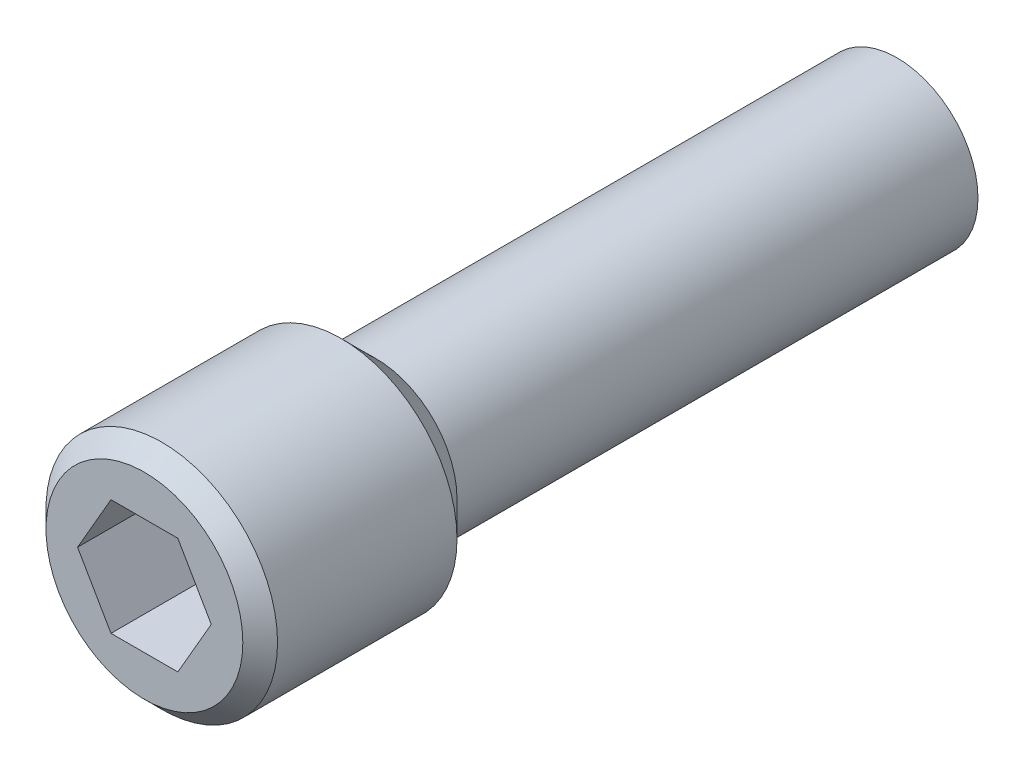
ISO-10303-21;
HEADER;
FILE_DESCRIPTION(('STEP AP214'),'2;1');
FILE_NAME('part.step','',(''),(''),'','','');
FILE_SCHEMA(('AUTOMOTIVE_DESIGN { 1 0 10303 214 1 1 1 1 }'));
ENDSEC;
DATA;
#1=APPLICATION_CONTEXT('core data for automotive mechanical design processes');
#2=APPLICATION_PROTOCOL_DEFINITION('international standard','automotive_design',2000,#1);
#3=PRODUCT_CONTEXT('',#1,'mechanical');
#4=PRODUCT('Part','Part','',(#3));
#5=PRODUCT_RELATED_PRODUCT_CATEGORY('part','',(#4));
#6=PRODUCT_DEFINITION_FORMATION('','',#4);
#7=PRODUCT_DEFINITION_CONTEXT('part definition',#1,'design');
#8=PRODUCT_DEFINITION('design','',#6,#7);
#9=PRODUCT_DEFINITION_SHAPE('','',#8);
#10=(LENGTH_UNIT() NAMED_UNIT(*) SI_UNIT(.MILLI.,.METRE.));
#11=(NAMED_UNIT(*) PLANE_ANGLE_UNIT() SI_UNIT($,.RADIAN.));
#12=(NAMED_UNIT(*) SI_UNIT($,.STERADIAN.) SOLID_ANGLE_UNIT());
#13=UNCERTAINTY_MEASURE_WITH_UNIT(LENGTH_MEASURE(1.E-05),#10,'distance_accuracy_value','');
#14=(GEOMETRIC_REPRESENTATION_CONTEXT(3) GLOBAL_UNCERTAINTY_ASSIGNED_CONTEXT((#13)) GLOBAL_UNIT_ASSIGNED_CONTEXT((#10,
#11,#12)) REPRESENTATION_CONTEXT('',''));
#15=CARTESIAN_POINT('',(0.,0.,0.));
#16=DIRECTION('',(0.,0.,1.));
#17=DIRECTION('',(1.,0.,0.));
#18=AXIS2_PLACEMENT_3D('',#15,#16,#17);
#19=CARTESIAN_POINT('',(0.,0.,59.2));
#20=DIRECTION('',(0.,0.,-1.));
#21=DIRECTION('',(-1.,0.,0.));
#22=AXIS2_PLACEMENT_3D('',#19,#20,#21);
#23=CYLINDRICAL_SURFACE('',#22,0.95);
#24=CARTESIAN_POINT('',(0.,0.,48.));
#25=DIRECTION('',(0.,0.,-1.));
#26=DIRECTION('',(1.,0.,0.));
#27=AXIS2_PLACEMENT_3D('',#24,#25,#26);
#28=CIRCLE('',#27,0.95);
#29=CARTESIAN_POINT('',(0.95,0.,48.));
#30=VERTEX_POINT('',#29);
#31=EDGE_CURVE('E26',#30,#30,#28,.T.);
#32=ORIENTED_EDGE('',*,*,#31,.T.);
#33=EDGE_LOOP('',(#32));
#34=FACE_BOUND('',#33,.T.);
#35=CARTESIAN_POINT('',(0.,0.,59.2));
#36=DIRECTION('',(0.,0.,-1.));
#37=DIRECTION('',(-1.,0.,0.));
#38=AXIS2_PLACEMENT_3D('',#35,#36,#37);
#39=CIRCLE('',#38,0.95);
#40=CARTESIAN_POINT('',(-0.95,0.,59.2));
#41=VERTEX_POINT('',#40);
#42=EDGE_CURVE('E11',#41,#41,#39,.T.);
#43=ORIENTED_EDGE('',*,*,#42,.F.);
#44=EDGE_LOOP('',(#43));
#45=FACE_BOUND('',#44,.T.);
#46=ADVANCED_FACE('F17',(#34,#45),#23,.F.);
#47=CARTESIAN_POINT('',(0.,0.,61.));
#48=DIRECTION('',(0.,0.,-1.));
#49=DIRECTION('',(-1.,0.,0.));
#50=AXIS2_PLACEMENT_3D('',#47,#48,#49);
#51=CONICAL_SURFACE('',#50,1.7,0.785398163397457);
#52=CARTESIAN_POINT('',(0.,0.,61.));
#53=DIRECTION('',(0.,0.,1.));
#54=DIRECTION('',(1.,0.,0.));
#55=AXIS2_PLACEMENT_3D('',#52,#53,#54);
#56=CIRCLE('',#55,1.7);
#57=CARTESIAN_POINT('',(1.7,0.,61.));
#58=VERTEX_POINT('',#57);
#59=EDGE_CURVE('E159',#58,#58,#56,.T.);
#60=ORIENTED_EDGE('',*,*,#59,.F.);
#61=EDGE_LOOP('',(#60));
#62=FACE_BOUND('',#61,.T.);
#63=CARTESIAN_POINT('',(0.,0.,60.7));
#64=DIRECTION('',(0.,0.,-1.));
#65=DIRECTION('',(1.,0.,0.));
#66=AXIS2_PLACEMENT_3D('',#63,#64,#65);
#67=CIRCLE('',#66,2.);
#68=CARTESIAN_POINT('',(2.,0.,60.7));
#69=VERTEX_POINT('',#68);
#70=EDGE_CURVE('E155',#69,#69,#67,.T.);
#71=ORIENTED_EDGE('',*,*,#70,.F.);
#72=EDGE_LOOP('',(#71));
#73=FACE_BOUND('',#72,.T.);
#74=ADVANCED_FACE('F335',(#62,#73),#51,.T.);
#75=CARTESIAN_POINT('',(0.,0.,57.6));
#76=DIRECTION('',(0.,0.,1.));
#77=DIRECTION('',(1.,0.,0.));
#78=AXIS2_PLACEMENT_3D('',#75,#76,#77);
#79=CONICAL_SURFACE('',#78,2.,0.785398163397448);
#80=CARTESIAN_POINT('',(0.,0.,57.6));
#81=DIRECTION('',(0.,0.,1.));
#82=DIRECTION('',(1.,0.,0.));
#83=AXIS2_PLACEMENT_3D('',#80,#81,#82);
#84=CIRCLE('',#83,2.);
#85=CARTESIAN_POINT('',(2.,0.,57.6));
#86=VERTEX_POINT('',#85);
#87=EDGE_CURVE('E158',#86,#86,#84,.T.);
#88=ORIENTED_EDGE('',*,*,#87,.F.);
#89=EDGE_LOOP('',(#88));
#90=FACE_BOUND('',#89,.T.);
#91=CARTESIAN_POINT('',(0.,0.,57.));
#92=DIRECTION('',(0.,0.,1.));
#93=DIRECTION('',(1.,0.,0.));
#94=AXIS2_PLACEMENT_3D('',#91,#92,#93);
#95=CIRCLE('',#94,1.4);
#96=CARTESIAN_POINT('',(1.4,0.,57.));
#97=VERTEX_POINT('',#96);
#98=EDGE_CURVE('E165',#97,#97,#95,.T.);
#99=ORIENTED_EDGE('',*,*,#98,.T.);
#100=EDGE_LOOP('',(#99));
#101=FACE_BOUND('',#100,.T.);
#102=ADVANCED_FACE('F19',(#90,#101),#79,.T.);
#103=CARTESIAN_POINT('',(0.,0.,59.2));
#104=DIRECTION('',(0.,0.,1.));
#105=DIRECTION('',(1.,0.,0.));
#106=AXIS2_PLACEMENT_3D('',#103,#104,#105);
#107=PLANE('',#106);
#108=DIRECTION('',(1.,0.,0.));
#109=VECTOR('',#108,1.);
#110=CARTESIAN_POINT('',(0.,-1.,59.2));
#111=LINE('',#110,#109);
#112=CARTESIAN_POINT('',(-0.577350269189626,-1.,59.2));
#113=VERTEX_POINT('',#112);
#114=CARTESIAN_POINT('',(0.577350269189626,-1.,59.2));
#115=VERTEX_POINT('',#114);
#116=EDGE_CURVE('E243',#113,#115,#111,.T.);
#117=ORIENTED_EDGE('',*,*,#116,.T.);
#118=DIRECTION('',(0.5,0.866025403784439,0.));
#119=VECTOR('',#118,1.);
#120=CARTESIAN_POINT('',(0.866025403784439,-0.5,59.2));
#121=LINE('',#120,#119);
#122=CARTESIAN_POINT('',(1.15470053837925,0.,59.2));
#123=VERTEX_POINT('',#122);
#124=EDGE_CURVE('E269',#115,#123,#121,.T.);
#125=ORIENTED_EDGE('',*,*,#124,.T.);
#126=DIRECTION('',(-0.5,0.866025403784439,0.));
#127=VECTOR('',#126,1.);
#128=CARTESIAN_POINT('',(0.86602540378444,0.5,59.2));
#129=LINE('',#128,#127);
#130=CARTESIAN_POINT('',(0.577350269189627,1.,59.2));
#131=VERTEX_POINT('',#130);
#132=EDGE_CURVE('E150',#123,#131,#129,.T.);
#133=ORIENTED_EDGE('',*,*,#132,.T.);
#134=DIRECTION('',(-1.,0.,0.));
#135=VECTOR('',#134,1.);
#136=CARTESIAN_POINT('',(0.,1.,59.2));
#137=LINE('',#136,#135);
#138=CARTESIAN_POINT('',(-0.577350269189626,1.,59.2));
#139=VERTEX_POINT('',#138);
#140=EDGE_CURVE('E118',#131,#139,#137,.T.);
#141=ORIENTED_EDGE('',*,*,#140,.T.);
#142=DIRECTION('',(-0.5,-0.866025403784439,0.));
#143=VECTOR('',#142,1.);
#144=CARTESIAN_POINT('',(-0.866025403784439,0.5,59.2));
#145=LINE('',#144,#143);
#146=CARTESIAN_POINT('',(-1.15470053837925,0.,59.2));
#147=VERTEX_POINT('',#146);
#148=EDGE_CURVE('E111',#139,#147,#145,.T.);
#149=ORIENTED_EDGE('',*,*,#148,.T.);
#150=DIRECTION('',(0.5,-0.866025403784439,0.));
#151=VECTOR('',#150,1.);
#152=CARTESIAN_POINT('',(-0.866025403784438,-0.5,59.2));
#153=LINE('',#152,#151);
#154=EDGE_CURVE('E115',#147,#113,#153,.T.);
#155=ORIENTED_EDGE('',*,*,#154,.T.);
#156=EDGE_LOOP('',(#117,#125,#133,#141,#149,#155));
#157=FACE_BOUND('',#156,.T.);
#158=ORIENTED_EDGE('',*,*,#42,.T.);
#159=EDGE_LOOP('',(#158));
#160=FACE_BOUND('',#159,.T.);
#161=ADVANCED_FACE('F113',(#157,#160),#107,.T.);
#162=CARTESIAN_POINT('',(0.,0.,48.));
#163=DIRECTION('',(0.,0.,1.));
#164=DIRECTION('',(1.,0.,0.));
#165=AXIS2_PLACEMENT_3D('',#162,#163,#164);
#166=PLANE('',#165);
#167=CARTESIAN_POINT('',(0.,0.,48.));
#168=DIRECTION('',(0.,0.,1.));
#169=DIRECTION('',(1.,0.,0.));
#170=AXIS2_PLACEMENT_3D('',#167,#168,#169);
#171=CIRCLE('',#170,1.4);
#172=CARTESIAN_POINT('',(1.4,0.,48.));
#173=VERTEX_POINT('',#172);
#174=EDGE_CURVE('E162',#173,#173,#171,.T.);
#175=ORIENTED_EDGE('',*,*,#174,.F.);
#176=EDGE_LOOP('',(#175));
#177=FACE_BOUND('',#176,.T.);
#178=ORIENTED_EDGE('',*,*,#31,.F.);
#179=EDGE_LOOP('',(#178));
#180=FACE_BOUND('',#179,.T.);
#181=ADVANCED_FACE('F353',(#177,#180),#166,.F.);
#182=CARTESIAN_POINT('',(0.,0.,48.));
#183=DIRECTION('',(0.,0.,1.));
#184=DIRECTION('',(1.,0.,0.));
#185=AXIS2_PLACEMENT_3D('',#182,#183,#184);
#186=CYLINDRICAL_SURFACE('',#185,1.4);
#187=ORIENTED_EDGE('',*,*,#98,.F.);
#188=EDGE_LOOP('',(#187));
#189=FACE_BOUND('',#188,.T.);
#190=ORIENTED_EDGE('',*,*,#174,.T.);
#191=EDGE_LOOP('',(#190));
#192=FACE_BOUND('',#191,.T.);
#193=ADVANCED_FACE('F348',(#189,#192),#186,.T.);
#194=CARTESIAN_POINT('',(0.,0.,61.));
#195=DIRECTION('',(0.,0.,1.));
#196=DIRECTION('',(1.,0.,0.));
#197=AXIS2_PLACEMENT_3D('',#194,#195,#196);
#198=PLANE('',#197);
#199=DIRECTION('',(0.5,0.866025403784439,0.));
#200=VECTOR('',#199,1.);
#201=CARTESIAN_POINT('',(0.866025403784439,-0.5,61.));
#202=LINE('',#201,#200);
#203=CARTESIAN_POINT('',(0.577350269189626,-1.,61.));
#204=VERTEX_POINT('',#203);
#205=CARTESIAN_POINT('',(1.15470053837925,0.,61.));
#206=VERTEX_POINT('',#205);
#207=EDGE_CURVE('E257',#204,#206,#202,.T.);
#208=ORIENTED_EDGE('',*,*,#207,.F.);
#209=DIRECTION('',(1.,0.,0.));
#210=VECTOR('',#209,1.);
#211=CARTESIAN_POINT('',(0.,-1.,61.));
#212=LINE('',#211,#210);
#213=CARTESIAN_POINT('',(-0.577350269189626,-1.,61.));
#214=VERTEX_POINT('',#213);
#215=EDGE_CURVE('E140',#214,#204,#212,.T.);
#216=ORIENTED_EDGE('',*,*,#215,.F.);
#217=DIRECTION('',(0.5,-0.866025403784439,0.));
#218=VECTOR('',#217,1.);
#219=CARTESIAN_POINT('',(-0.866025403784438,-0.5,61.));
#220=LINE('',#219,#218);
#221=CARTESIAN_POINT('',(-1.15470053837925,0.,61.));
#222=VERTEX_POINT('',#221);
#223=EDGE_CURVE('E124',#222,#214,#220,.T.);
#224=ORIENTED_EDGE('',*,*,#223,.F.);
#225=DIRECTION('',(-0.5,-0.866025403784439,0.));
#226=VECTOR('',#225,1.);
#227=CARTESIAN_POINT('',(-0.866025403784439,0.5,61.));
#228=LINE('',#227,#226);
#229=CARTESIAN_POINT('',(-0.577350269189626,1.,61.));
#230=VERTEX_POINT('',#229);
#231=EDGE_CURVE('E130',#230,#222,#228,.T.);
#232=ORIENTED_EDGE('',*,*,#231,.F.);
#233=DIRECTION('',(-1.,0.,0.));
#234=VECTOR('',#233,1.);
#235=CARTESIAN_POINT('',(0.,1.,61.));
#236=LINE('',#235,#234);
#237=CARTESIAN_POINT('',(0.577350269189627,1.,61.));
#238=VERTEX_POINT('',#237);
#239=EDGE_CURVE('E154',#238,#230,#236,.T.);
#240=ORIENTED_EDGE('',*,*,#239,.F.);
#241=DIRECTION('',(-0.5,0.866025403784439,0.));
#242=VECTOR('',#241,1.);
#243=CARTESIAN_POINT('',(0.86602540378444,0.5,61.));
#244=LINE('',#243,#242);
#245=EDGE_CURVE('E153',#206,#238,#244,.T.);
#246=ORIENTED_EDGE('',*,*,#245,.F.);
#247=EDGE_LOOP('',(#208,#216,#224,#232,#240,#246));
#248=FACE_BOUND('',#247,.T.);
#249=ORIENTED_EDGE('',*,*,#59,.T.);
#250=EDGE_LOOP('',(#249));
#251=FACE_BOUND('',#250,.T.);
#252=ADVANCED_FACE('F311',(#248,#251),#198,.T.);
#253=CARTESIAN_POINT('',(0.,0.,57.));
#254=DIRECTION('',(0.,0.,1.));
#255=DIRECTION('',(1.,0.,0.));
#256=AXIS2_PLACEMENT_3D('',#253,#254,#255);
#257=CYLINDRICAL_SURFACE('',#256,2.);
#258=ORIENTED_EDGE('',*,*,#87,.T.);
#259=EDGE_LOOP('',(#258));
#260=FACE_BOUND('',#259,.T.);
#261=ORIENTED_EDGE('',*,*,#70,.T.);
#262=EDGE_LOOP('',(#261));
#263=FACE_BOUND('',#262,.T.);
#264=ADVANCED_FACE('F324',(#260,#263),#257,.T.);
#265=CARTESIAN_POINT('',(0.86602540378444,0.5,57.));
#266=DIRECTION('',(0.866025403784439,0.5,0.));
#267=DIRECTION('',(0.,0.,-1.));
#268=AXIS2_PLACEMENT_3D('',#265,#266,#267);
#269=PLANE('',#268);
#270=ORIENTED_EDGE('',*,*,#132,.F.);
#271=DIRECTION('',(0.,0.,1.));
#272=VECTOR('',#271,1.);
#273=CARTESIAN_POINT('',(1.15470053837925,0.,57.));
#274=LINE('',#273,#272);
#275=EDGE_CURVE('E251',#123,#206,#274,.T.);
#276=ORIENTED_EDGE('',*,*,#275,.T.);
#277=ORIENTED_EDGE('',*,*,#245,.T.);
#278=DIRECTION('',(0.,0.,1.));
#279=VECTOR('',#278,1.);
#280=CARTESIAN_POINT('',(0.577350269189627,1.,57.));
#281=LINE('',#280,#279);
#282=EDGE_CURVE('E178',#131,#238,#281,.T.);
#283=ORIENTED_EDGE('',*,*,#282,.F.);
#284=EDGE_LOOP('',(#270,#276,#277,#283));
#285=FACE_BOUND('',#284,.T.);
#286=ADVANCED_FACE('F322',(#285),#269,.F.);
#287=CARTESIAN_POINT('',(0.,1.,57.));
#288=DIRECTION('',(0.,1.,0.));
#289=DIRECTION('',(1.,0.,0.));
#290=AXIS2_PLACEMENT_3D('',#287,#288,#289);
#291=PLANE('',#290);
#292=ORIENTED_EDGE('',*,*,#140,.F.);
#293=ORIENTED_EDGE('',*,*,#282,.T.);
#294=ORIENTED_EDGE('',*,*,#239,.T.);
#295=DIRECTION('',(0.,0.,1.));
#296=VECTOR('',#295,1.);
#297=CARTESIAN_POINT('',(-0.577350269189626,1.,57.));
#298=LINE('',#297,#296);
#299=EDGE_CURVE('E123',#139,#230,#298,.T.);
#300=ORIENTED_EDGE('',*,*,#299,.F.);
#301=EDGE_LOOP('',(#292,#293,#294,#300));
#302=FACE_BOUND('',#301,.T.);
#303=ADVANCED_FACE('F307',(#302),#291,.F.);
#304=CARTESIAN_POINT('',(-0.866025403784439,0.5,57.));
#305=DIRECTION('',(-0.866025403784439,0.5,0.));
#306=DIRECTION('',(0.,0.,1.));
#307=AXIS2_PLACEMENT_3D('',#304,#305,#306);
#308=PLANE('',#307);
#309=ORIENTED_EDGE('',*,*,#148,.F.);
#310=ORIENTED_EDGE('',*,*,#299,.T.);
#311=ORIENTED_EDGE('',*,*,#231,.T.);
#312=DIRECTION('',(0.,0.,1.));
#313=VECTOR('',#312,1.);
#314=CARTESIAN_POINT('',(-1.15470053837925,0.,57.));
#315=LINE('',#314,#313);
#316=EDGE_CURVE('E127',#147,#222,#315,.T.);
#317=ORIENTED_EDGE('',*,*,#316,.F.);
#318=EDGE_LOOP('',(#309,#310,#311,#317));
#319=FACE_BOUND('',#318,.T.);
#320=ADVANCED_FACE('F128',(#319),#308,.F.);
#321=CARTESIAN_POINT('',(-0.866025403784438,-0.5,57.));
#322=DIRECTION('',(-0.866025403784439,-0.5,0.));
#323=DIRECTION('',(-0.5,0.866025403784439,0.));
#324=AXIS2_PLACEMENT_3D('',#321,#322,#323);
#325=PLANE('',#324);
#326=ORIENTED_EDGE('',*,*,#154,.F.);
#327=ORIENTED_EDGE('',*,*,#316,.T.);
#328=ORIENTED_EDGE('',*,*,#223,.T.);
#329=DIRECTION('',(0.,0.,1.));
#330=VECTOR('',#329,1.);
#331=CARTESIAN_POINT('',(-0.577350269189626,-1.,57.));
#332=LINE('',#331,#330);
#333=EDGE_CURVE('E137',#113,#214,#332,.T.);
#334=ORIENTED_EDGE('',*,*,#333,.F.);
#335=EDGE_LOOP('',(#326,#327,#328,#334));
#336=FACE_BOUND('',#335,.T.);
#337=ADVANCED_FACE('F135',(#336),#325,.F.);
#338=CARTESIAN_POINT('',(0.,-1.,57.));
#339=DIRECTION('',(0.,-1.,0.));
#340=DIRECTION('',(-1.,0.,0.));
#341=AXIS2_PLACEMENT_3D('',#338,#339,#340);
#342=PLANE('',#341);
#343=ORIENTED_EDGE('',*,*,#116,.F.);
#344=ORIENTED_EDGE('',*,*,#333,.T.);
#345=ORIENTED_EDGE('',*,*,#215,.T.);
#346=DIRECTION('',(0.,0.,1.));
#347=VECTOR('',#346,1.);
#348=CARTESIAN_POINT('',(0.577350269189626,-1.,57.));
#349=LINE('',#348,#347);
#350=EDGE_CURVE('E263',#115,#204,#349,.T.);
#351=ORIENTED_EDGE('',*,*,#350,.F.);
#352=EDGE_LOOP('',(#343,#344,#345,#351));
#353=FACE_BOUND('',#352,.T.);
#354=ADVANCED_FACE('F316',(#353),#342,.F.);
#355=CARTESIAN_POINT('',(0.866025403784439,-0.5,57.));
#356=DIRECTION('',(0.866025403784439,-0.5,0.));
#357=DIRECTION('',(0.,0.,-1.));
#358=AXIS2_PLACEMENT_3D('',#355,#356,#357);
#359=PLANE('',#358);
#360=ORIENTED_EDGE('',*,*,#124,.F.);
#361=ORIENTED_EDGE('',*,*,#350,.T.);
#362=ORIENTED_EDGE('',*,*,#207,.T.);
#363=ORIENTED_EDGE('',*,*,#275,.F.);
#364=EDGE_LOOP('',(#360,#361,#362,#363));
#365=FACE_BOUND('',#364,.T.);
#366=ADVANCED_FACE('F320',(#365),#359,.F.);
#367=CLOSED_SHELL('',(#46,#74,#102,#161,#181,#193,#252,#264,#286,#303,#320,#337,#354,#366));
#368=MANIFOLD_SOLID_BREP('B1',#367);
#369=ADVANCED_BREP_SHAPE_REPRESENTATION('',(#18,#368),#14);
#370=SHAPE_DEFINITION_REPRESENTATION(#9,#369);
ENDSEC;
END-ISO-10303-21;
